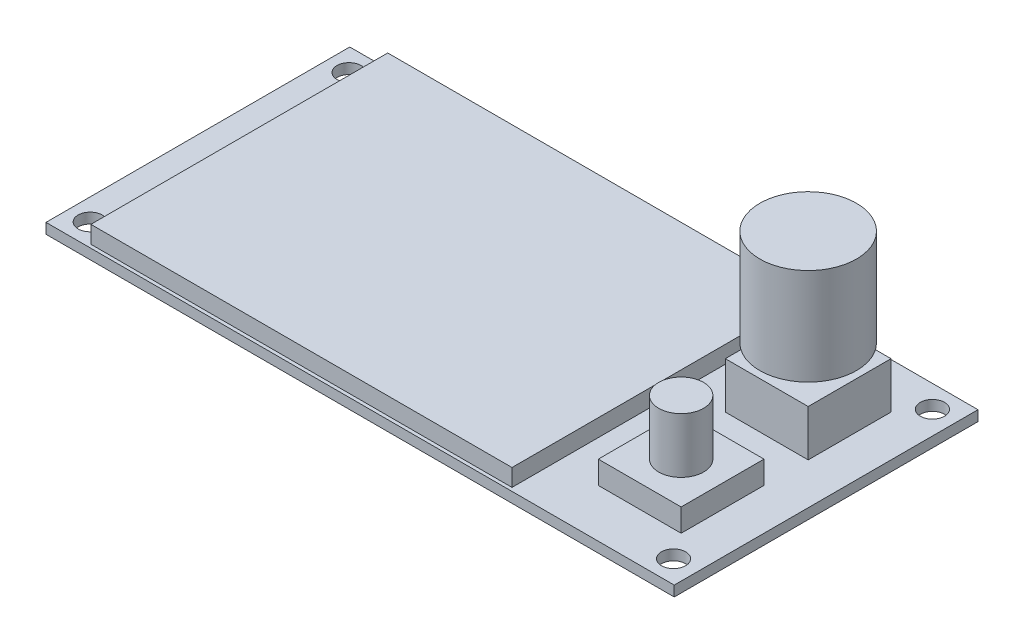
ISO-10303-21;
HEADER;
FILE_DESCRIPTION(('STEP AP214'),'2;1');
FILE_NAME('part.step','',(''),(''),'','','');
FILE_SCHEMA(('AUTOMOTIVE_DESIGN { 1 0 10303 214 1 1 1 1 }'));
ENDSEC;
DATA;
#1=APPLICATION_CONTEXT('core data for automotive mechanical design processes');
#2=APPLICATION_PROTOCOL_DEFINITION('international standard','automotive_design',2000,#1);
#3=PRODUCT_CONTEXT('',#1,'mechanical');
#4=PRODUCT('Part','Part','',(#3));
#5=PRODUCT_RELATED_PRODUCT_CATEGORY('part','',(#4));
#6=PRODUCT_DEFINITION_FORMATION('','',#4);
#7=PRODUCT_DEFINITION_CONTEXT('part definition',#1,'design');
#8=PRODUCT_DEFINITION('design','',#6,#7);
#9=PRODUCT_DEFINITION_SHAPE('','',#8);
#10=(LENGTH_UNIT() NAMED_UNIT(*) SI_UNIT(.MILLI.,.METRE.));
#11=(NAMED_UNIT(*) PLANE_ANGLE_UNIT() SI_UNIT($,.RADIAN.));
#12=(NAMED_UNIT(*) SI_UNIT($,.STERADIAN.) SOLID_ANGLE_UNIT());
#13=UNCERTAINTY_MEASURE_WITH_UNIT(LENGTH_MEASURE(1.E-05),#10,'distance_accuracy_value','');
#14=(GEOMETRIC_REPRESENTATION_CONTEXT(3) GLOBAL_UNCERTAINTY_ASSIGNED_CONTEXT((#13)) GLOBAL_UNIT_ASSIGNED_CONTEXT((#10,
#11,#12)) REPRESENTATION_CONTEXT('',''));
#15=CARTESIAN_POINT('',(0.,0.,0.));
#16=DIRECTION('',(0.,0.,1.));
#17=DIRECTION('',(1.,0.,0.));
#18=AXIS2_PLACEMENT_3D('',#15,#16,#17);
#19=CARTESIAN_POINT('',(73.,8.2,-19.));
#20=DIRECTION('',(1.,0.,0.));
#21=DIRECTION('',(0.,0.,-1.));
#22=AXIS2_PLACEMENT_3D('',#19,#20,#21);
#23=PLANE('',#22);
#24=DIRECTION('',(0.,0.,1.));
#25=VECTOR('',#24,1.);
#26=CARTESIAN_POINT('',(73.,4.8,-19.));
#27=LINE('',#26,#25);
#28=CARTESIAN_POINT('',(73.,4.8,-19.));
#29=VERTEX_POINT('',#28);
#30=CARTESIAN_POINT('',(73.,4.8,-7.));
#31=VERTEX_POINT('',#30);
#32=EDGE_CURVE('E161',#29,#31,#27,.T.);
#33=ORIENTED_EDGE('',*,*,#32,.F.);
#34=DIRECTION('',(0.,-1.,0.));
#35=VECTOR('',#34,1.);
#36=CARTESIAN_POINT('',(73.,8.2,-19.));
#37=LINE('',#36,#35);
#38=CARTESIAN_POINT('',(73.,1.5,-19.));
#39=VERTEX_POINT('',#38);
#40=EDGE_CURVE('E172',#29,#39,#37,.T.);
#41=ORIENTED_EDGE('',*,*,#40,.T.);
#42=DIRECTION('',(0.,0.,1.));
#43=VECTOR('',#42,1.);
#44=CARTESIAN_POINT('',(73.,1.5,-19.));
#45=LINE('',#44,#43);
#46=CARTESIAN_POINT('',(73.,1.5,-7.));
#47=VERTEX_POINT('',#46);
#48=EDGE_CURVE('E200',#39,#47,#45,.T.);
#49=ORIENTED_EDGE('',*,*,#48,.T.);
#50=DIRECTION('',(0.,-1.,0.));
#51=VECTOR('',#50,1.);
#52=CARTESIAN_POINT('',(73.,8.2,-7.));
#53=LINE('',#52,#51);
#54=EDGE_CURVE('E174',#31,#47,#53,.T.);
#55=ORIENTED_EDGE('',*,*,#54,.F.);
#56=EDGE_LOOP('',(#33,#41,#49,#55));
#57=FACE_BOUND('',#56,.T.);
#58=ADVANCED_FACE('F45',(#57),#23,.F.);
#59=CARTESIAN_POINT('',(73.,8.2,-7.));
#60=DIRECTION('',(0.,0.,-1.));
#61=DIRECTION('',(-1.,0.,0.));
#62=AXIS2_PLACEMENT_3D('',#59,#60,#61);
#63=PLANE('',#62);
#64=DIRECTION('',(1.,0.,0.));
#65=VECTOR('',#64,1.);
#66=CARTESIAN_POINT('',(73.,4.8,-7.));
#67=LINE('',#66,#65);
#68=CARTESIAN_POINT('',(85.,4.8,-7.));
#69=VERTEX_POINT('',#68);
#70=EDGE_CURVE('E176',#31,#69,#67,.T.);
#71=ORIENTED_EDGE('',*,*,#70,.F.);
#72=ORIENTED_EDGE('',*,*,#54,.T.);
#73=DIRECTION('',(1.,0.,0.));
#74=VECTOR('',#73,1.);
#75=CARTESIAN_POINT('',(73.,1.5,-7.));
#76=LINE('',#75,#74);
#77=CARTESIAN_POINT('',(85.,1.5,-7.));
#78=VERTEX_POINT('',#77);
#79=EDGE_CURVE('E196',#47,#78,#76,.T.);
#80=ORIENTED_EDGE('',*,*,#79,.T.);
#81=DIRECTION('',(0.,-1.,0.));
#82=VECTOR('',#81,1.);
#83=CARTESIAN_POINT('',(85.,8.2,-7.));
#84=LINE('',#83,#82);
#85=EDGE_CURVE('E189',#69,#78,#84,.T.);
#86=ORIENTED_EDGE('',*,*,#85,.F.);
#87=EDGE_LOOP('',(#71,#72,#80,#86));
#88=FACE_BOUND('',#87,.T.);
#89=ADVANCED_FACE('F408',(#88),#63,.F.);
#90=CARTESIAN_POINT('',(85.,8.2,-19.));
#91=DIRECTION('',(-1.,0.,0.));
#92=DIRECTION('',(0.,0.,1.));
#93=AXIS2_PLACEMENT_3D('',#90,#91,#92);
#94=PLANE('',#93);
#95=DIRECTION('',(0.,0.,-1.));
#96=VECTOR('',#95,1.);
#97=CARTESIAN_POINT('',(85.,4.8,-7.));
#98=LINE('',#97,#96);
#99=CARTESIAN_POINT('',(85.,4.8,-19.));
#100=VERTEX_POINT('',#99);
#101=EDGE_CURVE('E63',#69,#100,#98,.T.);
#102=ORIENTED_EDGE('',*,*,#101,.F.);
#103=ORIENTED_EDGE('',*,*,#85,.T.);
#104=DIRECTION('',(0.,0.,-1.));
#105=VECTOR('',#104,1.);
#106=CARTESIAN_POINT('',(85.,1.5,-19.));
#107=LINE('',#106,#105);
#108=CARTESIAN_POINT('',(85.,1.5,-19.));
#109=VERTEX_POINT('',#108);
#110=EDGE_CURVE('E187',#78,#109,#107,.T.);
#111=ORIENTED_EDGE('',*,*,#110,.T.);
#112=DIRECTION('',(0.,-1.,0.));
#113=VECTOR('',#112,1.);
#114=CARTESIAN_POINT('',(85.,8.2,-19.));
#115=LINE('',#114,#113);
#116=EDGE_CURVE('E183',#100,#109,#115,.T.);
#117=ORIENTED_EDGE('',*,*,#116,.F.);
#118=EDGE_LOOP('',(#102,#103,#111,#117));
#119=FACE_BOUND('',#118,.T.);
#120=ADVANCED_FACE('F404',(#119),#94,.F.);
#121=CARTESIAN_POINT('',(73.,8.2,-19.));
#122=DIRECTION('',(0.,0.,1.));
#123=DIRECTION('',(1.,0.,0.));
#124=AXIS2_PLACEMENT_3D('',#121,#122,#123);
#125=PLANE('',#124);
#126=DIRECTION('',(-1.,0.,0.));
#127=VECTOR('',#126,1.);
#128=CARTESIAN_POINT('',(85.,4.8,-19.));
#129=LINE('',#128,#127);
#130=EDGE_CURVE('E158',#100,#29,#129,.T.);
#131=ORIENTED_EDGE('',*,*,#130,.F.);
#132=ORIENTED_EDGE('',*,*,#116,.T.);
#133=DIRECTION('',(-1.,0.,0.));
#134=VECTOR('',#133,1.);
#135=CARTESIAN_POINT('',(73.,1.5,-19.));
#136=LINE('',#135,#134);
#137=EDGE_CURVE('E181',#109,#39,#136,.T.);
#138=ORIENTED_EDGE('',*,*,#137,.T.);
#139=ORIENTED_EDGE('',*,*,#40,.F.);
#140=EDGE_LOOP('',(#131,#132,#138,#139));
#141=FACE_BOUND('',#140,.T.);
#142=ADVANCED_FACE('F179',(#141),#125,.F.);
#143=CARTESIAN_POINT('',(0.,1.5,0.));
#144=DIRECTION('',(0.,-1.,0.));
#145=DIRECTION('',(0.,0.,-1.));
#146=AXIS2_PLACEMENT_3D('',#143,#144,#145);
#147=PLANE('',#146);
#148=ORIENTED_EDGE('',*,*,#48,.F.);
#149=ORIENTED_EDGE('',*,*,#137,.F.);
#150=ORIENTED_EDGE('',*,*,#110,.F.);
#151=ORIENTED_EDGE('',*,*,#79,.F.);
#152=EDGE_LOOP('',(#148,#149,#150,#151));
#153=FACE_BOUND('',#152,.T.);
#154=CARTESIAN_POINT('',(3.15000000000001,1.5,-40.75));
#155=DIRECTION('',(0.,1.,0.));
#156=DIRECTION('',(0.,0.,1.));
#157=AXIS2_PLACEMENT_3D('',#154,#155,#156);
#158=CIRCLE('',#157,1.75);
#159=CARTESIAN_POINT('',(3.15000000000001,1.5,-39.));
#160=VERTEX_POINT('',#159);
#161=EDGE_CURVE('E213',#160,#160,#158,.T.);
#162=ORIENTED_EDGE('',*,*,#161,.F.);
#163=EDGE_LOOP('',(#162));
#164=FACE_BOUND('',#163,.T.);
#165=CARTESIAN_POINT('',(3.15000000000002,1.5,-3.25));
#166=DIRECTION('',(0.,1.,0.));
#167=DIRECTION('',(0.,0.,1.));
#168=AXIS2_PLACEMENT_3D('',#165,#166,#167);
#169=CIRCLE('',#168,1.75);
#170=CARTESIAN_POINT('',(3.15000000000002,1.5,-1.5));
#171=VERTEX_POINT('',#170);
#172=EDGE_CURVE('E209',#171,#171,#169,.T.);
#173=ORIENTED_EDGE('',*,*,#172,.F.);
#174=EDGE_LOOP('',(#173));
#175=FACE_BOUND('',#174,.T.);
#176=CARTESIAN_POINT('',(87.65,1.5,-3.25));
#177=DIRECTION('',(0.,1.,0.));
#178=DIRECTION('',(0.,0.,1.));
#179=AXIS2_PLACEMENT_3D('',#176,#177,#178);
#180=CIRCLE('',#179,1.75);
#181=CARTESIAN_POINT('',(87.65,1.5,-1.5));
#182=VERTEX_POINT('',#181);
#183=EDGE_CURVE('E204',#182,#182,#180,.T.);
#184=ORIENTED_EDGE('',*,*,#183,.F.);
#185=EDGE_LOOP('',(#184));
#186=FACE_BOUND('',#185,.T.);
#187=CARTESIAN_POINT('',(87.65,1.5,-40.75));
#188=DIRECTION('',(0.,1.,0.));
#189=DIRECTION('',(0.,0.,1.));
#190=AXIS2_PLACEMENT_3D('',#187,#188,#189);
#191=CIRCLE('',#190,1.75);
#192=CARTESIAN_POINT('',(87.65,1.5,-39.));
#193=VERTEX_POINT('',#192);
#194=EDGE_CURVE('E208',#193,#193,#191,.T.);
#195=ORIENTED_EDGE('',*,*,#194,.F.);
#196=EDGE_LOOP('',(#195));
#197=FACE_BOUND('',#196,.T.);
#198=DIRECTION('',(0.,0.,1.));
#199=VECTOR('',#198,1.);
#200=CARTESIAN_POINT('',(0.,1.5,0.));
#201=LINE('',#200,#199);
#202=CARTESIAN_POINT('',(0.,1.5,-44.));
#203=VERTEX_POINT('',#202);
#204=CARTESIAN_POINT('',(0.,1.5,0.));
#205=VERTEX_POINT('',#204);
#206=EDGE_CURVE('E268',#203,#205,#201,.T.);
#207=ORIENTED_EDGE('',*,*,#206,.T.);
#208=DIRECTION('',(1.,0.,0.));
#209=VECTOR('',#208,1.);
#210=CARTESIAN_POINT('',(0.,1.5,0.));
#211=LINE('',#210,#209);
#212=CARTESIAN_POINT('',(91.,1.5,0.));
#213=VERTEX_POINT('',#212);
#214=EDGE_CURVE('E272',#205,#213,#211,.T.);
#215=ORIENTED_EDGE('',*,*,#214,.T.);
#216=DIRECTION('',(0.,0.,-1.));
#217=VECTOR('',#216,1.);
#218=CARTESIAN_POINT('',(91.,1.5,0.));
#219=LINE('',#218,#217);
#220=CARTESIAN_POINT('',(91.,1.5,-44.));
#221=VERTEX_POINT('',#220);
#222=EDGE_CURVE('E276',#213,#221,#219,.T.);
#223=ORIENTED_EDGE('',*,*,#222,.T.);
#224=DIRECTION('',(-1.,0.,0.));
#225=VECTOR('',#224,1.);
#226=CARTESIAN_POINT('',(0.,1.5,-44.));
#227=LINE('',#226,#225);
#228=EDGE_CURVE('E279',#221,#203,#227,.T.);
#229=ORIENTED_EDGE('',*,*,#228,.T.);
#230=EDGE_LOOP('',(#207,#215,#223,#229));
#231=FACE_BOUND('',#230,.T.);
#232=DIRECTION('',(0.,0.,1.));
#233=VECTOR('',#232,1.);
#234=CARTESIAN_POINT('',(5.99999999999999,1.5,-43.5));
#235=LINE('',#234,#233);
#236=CARTESIAN_POINT('',(5.99999999999999,1.5,-43.5));
#237=VERTEX_POINT('',#236);
#238=CARTESIAN_POINT('',(6.,1.5,-0.500000000000001));
#239=VERTEX_POINT('',#238);
#240=EDGE_CURVE('E237',#237,#239,#235,.T.);
#241=ORIENTED_EDGE('',*,*,#240,.F.);
#242=DIRECTION('',(-1.,0.,0.));
#243=VECTOR('',#242,1.);
#244=CARTESIAN_POINT('',(5.99999999999999,1.5,-43.5));
#245=LINE('',#244,#243);
#246=CARTESIAN_POINT('',(67.,1.5,-43.5));
#247=VERTEX_POINT('',#246);
#248=EDGE_CURVE('E227',#247,#237,#245,.T.);
#249=ORIENTED_EDGE('',*,*,#248,.F.);
#250=DIRECTION('',(0.,0.,-1.));
#251=VECTOR('',#250,1.);
#252=CARTESIAN_POINT('',(67.,1.5,-43.5));
#253=LINE('',#252,#251);
#254=CARTESIAN_POINT('',(67.,1.5,-0.500000000000001));
#255=VERTEX_POINT('',#254);
#256=EDGE_CURVE('E245',#255,#247,#253,.T.);
#257=ORIENTED_EDGE('',*,*,#256,.F.);
#258=DIRECTION('',(1.,0.,0.));
#259=VECTOR('',#258,1.);
#260=CARTESIAN_POINT('',(6.,1.5,-0.500000000000001));
#261=LINE('',#260,#259);
#262=EDGE_CURVE('E241',#239,#255,#261,.T.);
#263=ORIENTED_EDGE('',*,*,#262,.F.);
#264=EDGE_LOOP('',(#241,#249,#257,#263));
#265=FACE_BOUND('',#264,.T.);
#266=DIRECTION('',(0.,0.,1.));
#267=VECTOR('',#266,1.);
#268=CARTESIAN_POINT('',(73.,1.5,-37.4));
#269=LINE('',#268,#267);
#270=CARTESIAN_POINT('',(73.,1.5,-37.4));
#271=VERTEX_POINT('',#270);
#272=CARTESIAN_POINT('',(73.,1.5,-25.4));
#273=VERTEX_POINT('',#272);
#274=EDGE_CURVE('E203',#271,#273,#269,.T.);
#275=ORIENTED_EDGE('',*,*,#274,.F.);
#276=DIRECTION('',(-1.,0.,0.));
#277=VECTOR('',#276,1.);
#278=CARTESIAN_POINT('',(73.,1.5,-37.4));
#279=LINE('',#278,#277);
#280=CARTESIAN_POINT('',(85.,1.5,-37.4));
#281=VERTEX_POINT('',#280);
#282=EDGE_CURVE('E361',#281,#271,#279,.T.);
#283=ORIENTED_EDGE('',*,*,#282,.F.);
#284=DIRECTION('',(0.,0.,-1.));
#285=VECTOR('',#284,1.);
#286=CARTESIAN_POINT('',(85.,1.5,-37.4));
#287=LINE('',#286,#285);
#288=CARTESIAN_POINT('',(85.,1.5,-25.4));
#289=VERTEX_POINT('',#288);
#290=EDGE_CURVE('E379',#289,#281,#287,.T.);
#291=ORIENTED_EDGE('',*,*,#290,.F.);
#292=DIRECTION('',(1.,0.,0.));
#293=VECTOR('',#292,1.);
#294=CARTESIAN_POINT('',(73.,1.5,-25.4));
#295=LINE('',#294,#293);
#296=EDGE_CURVE('E71',#273,#289,#295,.T.);
#297=ORIENTED_EDGE('',*,*,#296,.F.);
#298=EDGE_LOOP('',(#275,#283,#291,#297));
#299=FACE_BOUND('',#298,.T.);
#300=ADVANCED_FACE('F354',(#153,#164,#175,#186,#197,#231,#265,#299),#147,.F.);
#301=CARTESIAN_POINT('',(0.,1.5,0.));
#302=DIRECTION('',(1.,0.,0.));
#303=DIRECTION('',(0.,0.,-1.));
#304=AXIS2_PLACEMENT_3D('',#301,#302,#303);
#305=PLANE('',#304);
#306=DIRECTION('',(0.,0.,1.));
#307=VECTOR('',#306,1.);
#308=CARTESIAN_POINT('',(0.,0.,0.));
#309=LINE('',#308,#307);
#310=CARTESIAN_POINT('',(0.,0.,-44.));
#311=VERTEX_POINT('',#310);
#312=CARTESIAN_POINT('',(0.,0.,0.));
#313=VERTEX_POINT('',#312);
#314=EDGE_CURVE('E267',#311,#313,#309,.T.);
#315=ORIENTED_EDGE('',*,*,#314,.T.);
#316=DIRECTION('',(0.,-1.,0.));
#317=VECTOR('',#316,1.);
#318=CARTESIAN_POINT('',(0.,1.5,0.));
#319=LINE('',#318,#317);
#320=EDGE_CURVE('E55',#205,#313,#319,.T.);
#321=ORIENTED_EDGE('',*,*,#320,.F.);
#322=ORIENTED_EDGE('',*,*,#206,.F.);
#323=DIRECTION('',(0.,-1.,0.));
#324=VECTOR('',#323,1.);
#325=CARTESIAN_POINT('',(0.,1.5,-44.));
#326=LINE('',#325,#324);
#327=EDGE_CURVE('E282',#203,#311,#326,.T.);
#328=ORIENTED_EDGE('',*,*,#327,.T.);
#329=EDGE_LOOP('',(#315,#321,#322,#328));
#330=FACE_BOUND('',#329,.T.);
#331=ADVANCED_FACE('F47',(#330),#305,.F.);
#332=CARTESIAN_POINT('',(0.,1.5,0.));
#333=DIRECTION('',(0.,0.,-1.));
#334=DIRECTION('',(-1.,0.,0.));
#335=AXIS2_PLACEMENT_3D('',#332,#333,#334);
#336=PLANE('',#335);
#337=DIRECTION('',(1.,0.,0.));
#338=VECTOR('',#337,1.);
#339=CARTESIAN_POINT('',(0.,0.,0.));
#340=LINE('',#339,#338);
#341=CARTESIAN_POINT('',(91.,0.,0.));
#342=VERTEX_POINT('',#341);
#343=EDGE_CURVE('E286',#313,#342,#340,.T.);
#344=ORIENTED_EDGE('',*,*,#343,.T.);
#345=DIRECTION('',(0.,-1.,0.));
#346=VECTOR('',#345,1.);
#347=CARTESIAN_POINT('',(91.,1.5,0.));
#348=LINE('',#347,#346);
#349=EDGE_CURVE('E301',#213,#342,#348,.T.);
#350=ORIENTED_EDGE('',*,*,#349,.F.);
#351=ORIENTED_EDGE('',*,*,#214,.F.);
#352=ORIENTED_EDGE('',*,*,#320,.T.);
#353=EDGE_LOOP('',(#344,#350,#351,#352));
#354=FACE_BOUND('',#353,.T.);
#355=ADVANCED_FACE('F352',(#354),#336,.F.);
#356=CARTESIAN_POINT('',(91.,1.5,0.));
#357=DIRECTION('',(-1.,0.,0.));
#358=DIRECTION('',(0.,0.,1.));
#359=AXIS2_PLACEMENT_3D('',#356,#357,#358);
#360=PLANE('',#359);
#361=DIRECTION('',(0.,0.,-1.));
#362=VECTOR('',#361,1.);
#363=CARTESIAN_POINT('',(91.,0.,0.));
#364=LINE('',#363,#362);
#365=CARTESIAN_POINT('',(91.,0.,-44.));
#366=VERTEX_POINT('',#365);
#367=EDGE_CURVE('E289',#342,#366,#364,.T.);
#368=ORIENTED_EDGE('',*,*,#367,.T.);
#369=DIRECTION('',(0.,-1.,0.));
#370=VECTOR('',#369,1.);
#371=CARTESIAN_POINT('',(91.,1.5,-44.));
#372=LINE('',#371,#370);
#373=EDGE_CURVE('E297',#221,#366,#372,.T.);
#374=ORIENTED_EDGE('',*,*,#373,.F.);
#375=ORIENTED_EDGE('',*,*,#222,.F.);
#376=ORIENTED_EDGE('',*,*,#349,.T.);
#377=EDGE_LOOP('',(#368,#374,#375,#376));
#378=FACE_BOUND('',#377,.T.);
#379=ADVANCED_FACE('F349',(#378),#360,.F.);
#380=CARTESIAN_POINT('',(0.,1.5,-44.));
#381=DIRECTION('',(0.,0.,1.));
#382=DIRECTION('',(1.,0.,0.));
#383=AXIS2_PLACEMENT_3D('',#380,#381,#382);
#384=PLANE('',#383);
#385=DIRECTION('',(-1.,0.,0.));
#386=VECTOR('',#385,1.);
#387=CARTESIAN_POINT('',(0.,0.,-44.));
#388=LINE('',#387,#386);
#389=EDGE_CURVE('E273',#366,#311,#388,.T.);
#390=ORIENTED_EDGE('',*,*,#389,.T.);
#391=ORIENTED_EDGE('',*,*,#327,.F.);
#392=ORIENTED_EDGE('',*,*,#228,.F.);
#393=ORIENTED_EDGE('',*,*,#373,.T.);
#394=EDGE_LOOP('',(#390,#391,#392,#393));
#395=FACE_BOUND('',#394,.T.);
#396=ADVANCED_FACE('F330',(#395),#384,.F.);
#397=CARTESIAN_POINT('',(0.,0.,0.));
#398=DIRECTION('',(0.,-1.,0.));
#399=DIRECTION('',(0.,0.,-1.));
#400=AXIS2_PLACEMENT_3D('',#397,#398,#399);
#401=PLANE('',#400);
#402=CARTESIAN_POINT('',(3.15000000000001,0.,-40.75));
#403=DIRECTION('',(0.,-1.,0.));
#404=DIRECTION('',(0.,0.,-1.));
#405=AXIS2_PLACEMENT_3D('',#402,#403,#404);
#406=CIRCLE('',#405,1.75);
#407=CARTESIAN_POINT('',(3.15000000000001,0.,-42.5));
#408=VERTEX_POINT('',#407);
#409=EDGE_CURVE('E49',#408,#408,#406,.T.);
#410=ORIENTED_EDGE('',*,*,#409,.F.);
#411=EDGE_LOOP('',(#410));
#412=FACE_BOUND('',#411,.T.);
#413=CARTESIAN_POINT('',(3.15000000000002,0.,-3.25));
#414=DIRECTION('',(0.,-1.,0.));
#415=DIRECTION('',(0.,0.,-1.));
#416=AXIS2_PLACEMENT_3D('',#413,#414,#415);
#417=CIRCLE('',#416,1.75);
#418=CARTESIAN_POINT('',(3.15000000000002,0.,-5.));
#419=VERTEX_POINT('',#418);
#420=EDGE_CURVE('E314',#419,#419,#417,.T.);
#421=ORIENTED_EDGE('',*,*,#420,.F.);
#422=EDGE_LOOP('',(#421));
#423=FACE_BOUND('',#422,.T.);
#424=CARTESIAN_POINT('',(87.65,0.,-3.25));
#425=DIRECTION('',(0.,-1.,0.));
#426=DIRECTION('',(0.,0.,-1.));
#427=AXIS2_PLACEMENT_3D('',#424,#425,#426);
#428=CIRCLE('',#427,1.75);
#429=CARTESIAN_POINT('',(87.65,0.,-5.));
#430=VERTEX_POINT('',#429);
#431=EDGE_CURVE('E311',#430,#430,#428,.T.);
#432=ORIENTED_EDGE('',*,*,#431,.F.);
#433=EDGE_LOOP('',(#432));
#434=FACE_BOUND('',#433,.T.);
#435=CARTESIAN_POINT('',(87.65,0.,-40.75));
#436=DIRECTION('',(0.,-1.,0.));
#437=DIRECTION('',(0.,0.,-1.));
#438=AXIS2_PLACEMENT_3D('',#435,#436,#437);
#439=CIRCLE('',#438,1.75);
#440=CARTESIAN_POINT('',(87.65,0.,-42.5));
#441=VERTEX_POINT('',#440);
#442=EDGE_CURVE('E221',#441,#441,#439,.T.);
#443=ORIENTED_EDGE('',*,*,#442,.F.);
#444=EDGE_LOOP('',(#443));
#445=FACE_BOUND('',#444,.T.);
#446=ORIENTED_EDGE('',*,*,#314,.F.);
#447=ORIENTED_EDGE('',*,*,#389,.F.);
#448=ORIENTED_EDGE('',*,*,#367,.F.);
#449=ORIENTED_EDGE('',*,*,#343,.F.);
#450=EDGE_LOOP('',(#446,#447,#448,#449));
#451=FACE_BOUND('',#450,.T.);
#452=ADVANCED_FACE('F326',(#412,#423,#434,#445,#451),#401,.T.);
#453=CARTESIAN_POINT('',(5.99999999999999,4.,-43.5));
#454=DIRECTION('',(1.,0.,0.));
#455=DIRECTION('',(0.,0.,-1.));
#456=AXIS2_PLACEMENT_3D('',#453,#454,#455);
#457=PLANE('',#456);
#458=ORIENTED_EDGE('',*,*,#240,.T.);
#459=DIRECTION('',(0.,-1.,0.));
#460=VECTOR('',#459,1.);
#461=CARTESIAN_POINT('',(6.,4.,-0.500000000000001));
#462=LINE('',#461,#460);
#463=CARTESIAN_POINT('',(6.,4.,-0.500000000000001));
#464=VERTEX_POINT('',#463);
#465=EDGE_CURVE('E263',#464,#239,#462,.T.);
#466=ORIENTED_EDGE('',*,*,#465,.F.);
#467=DIRECTION('',(0.,0.,1.));
#468=VECTOR('',#467,1.);
#469=CARTESIAN_POINT('',(5.99999999999999,4.,-43.5));
#470=LINE('',#469,#468);
#471=CARTESIAN_POINT('',(5.99999999999999,4.,-43.5));
#472=VERTEX_POINT('',#471);
#473=EDGE_CURVE('E222',#472,#464,#470,.T.);
#474=ORIENTED_EDGE('',*,*,#473,.F.);
#475=DIRECTION('',(0.,-1.,0.));
#476=VECTOR('',#475,1.);
#477=CARTESIAN_POINT('',(5.99999999999999,4.,-43.5));
#478=LINE('',#477,#476);
#479=EDGE_CURVE('E236',#472,#237,#478,.T.);
#480=ORIENTED_EDGE('',*,*,#479,.T.);
#481=EDGE_LOOP('',(#458,#466,#474,#480));
#482=FACE_BOUND('',#481,.T.);
#483=ADVANCED_FACE('F329',(#482),#457,.F.);
#484=CARTESIAN_POINT('',(6.,4.,-0.500000000000001));
#485=DIRECTION('',(0.,0.,-1.));
#486=DIRECTION('',(-1.,0.,0.));
#487=AXIS2_PLACEMENT_3D('',#484,#485,#486);
#488=PLANE('',#487);
#489=ORIENTED_EDGE('',*,*,#262,.T.);
#490=DIRECTION('',(0.,-1.,0.));
#491=VECTOR('',#490,1.);
#492=CARTESIAN_POINT('',(67.,4.,-0.500000000000001));
#493=LINE('',#492,#491);
#494=CARTESIAN_POINT('',(67.,4.,-0.500000000000001));
#495=VERTEX_POINT('',#494);
#496=EDGE_CURVE('E259',#495,#255,#493,.T.);
#497=ORIENTED_EDGE('',*,*,#496,.F.);
#498=DIRECTION('',(1.,0.,0.));
#499=VECTOR('',#498,1.);
#500=CARTESIAN_POINT('',(6.,4.,-0.500000000000001));
#501=LINE('',#500,#499);
#502=EDGE_CURVE('E226',#464,#495,#501,.T.);
#503=ORIENTED_EDGE('',*,*,#502,.F.);
#504=ORIENTED_EDGE('',*,*,#465,.T.);
#505=EDGE_LOOP('',(#489,#497,#503,#504));
#506=FACE_BOUND('',#505,.T.);
#507=ADVANCED_FACE('F481',(#506),#488,.F.);
#508=CARTESIAN_POINT('',(67.,4.,-43.5));
#509=DIRECTION('',(-1.,0.,0.));
#510=DIRECTION('',(0.,0.,1.));
#511=AXIS2_PLACEMENT_3D('',#508,#509,#510);
#512=PLANE('',#511);
#513=ORIENTED_EDGE('',*,*,#256,.T.);
#514=DIRECTION('',(0.,-1.,0.));
#515=VECTOR('',#514,1.);
#516=CARTESIAN_POINT('',(67.,4.,-43.5));
#517=LINE('',#516,#515);
#518=CARTESIAN_POINT('',(67.,4.,-43.5));
#519=VERTEX_POINT('',#518);
#520=EDGE_CURVE('E255',#519,#247,#517,.T.);
#521=ORIENTED_EDGE('',*,*,#520,.F.);
#522=DIRECTION('',(0.,0.,-1.));
#523=VECTOR('',#522,1.);
#524=CARTESIAN_POINT('',(67.,4.,-43.5));
#525=LINE('',#524,#523);
#526=EDGE_CURVE('E230',#495,#519,#525,.T.);
#527=ORIENTED_EDGE('',*,*,#526,.F.);
#528=ORIENTED_EDGE('',*,*,#496,.T.);
#529=EDGE_LOOP('',(#513,#521,#527,#528));
#530=FACE_BOUND('',#529,.T.);
#531=ADVANCED_FACE('F477',(#530),#512,.F.);
#532=CARTESIAN_POINT('',(5.99999999999999,4.,-43.5));
#533=DIRECTION('',(0.,0.,1.));
#534=DIRECTION('',(1.,0.,0.));
#535=AXIS2_PLACEMENT_3D('',#532,#533,#534);
#536=PLANE('',#535);
#537=ORIENTED_EDGE('',*,*,#248,.T.);
#538=ORIENTED_EDGE('',*,*,#479,.F.);
#539=DIRECTION('',(-1.,0.,0.));
#540=VECTOR('',#539,1.);
#541=CARTESIAN_POINT('',(5.99999999999999,4.,-43.5));
#542=LINE('',#541,#540);
#543=EDGE_CURVE('E233',#519,#472,#542,.T.);
#544=ORIENTED_EDGE('',*,*,#543,.F.);
#545=ORIENTED_EDGE('',*,*,#520,.T.);
#546=EDGE_LOOP('',(#537,#538,#544,#545));
#547=FACE_BOUND('',#546,.T.);
#548=ADVANCED_FACE('F473',(#547),#536,.F.);
#549=CARTESIAN_POINT('',(0.,4.,0.));
#550=DIRECTION('',(0.,1.,0.));
#551=DIRECTION('',(0.,0.,1.));
#552=AXIS2_PLACEMENT_3D('',#549,#550,#551);
#553=PLANE('',#552);
#554=ORIENTED_EDGE('',*,*,#473,.T.);
#555=ORIENTED_EDGE('',*,*,#502,.T.);
#556=ORIENTED_EDGE('',*,*,#526,.T.);
#557=ORIENTED_EDGE('',*,*,#543,.T.);
#558=EDGE_LOOP('',(#554,#555,#556,#557));
#559=FACE_BOUND('',#558,.T.);
#560=ADVANCED_FACE('F469',(#559),#553,.T.);
#561=CARTESIAN_POINT('',(87.65,-1.,-40.75));
#562=DIRECTION('',(0.,1.,0.));
#563=DIRECTION('',(0.,0.,1.));
#564=AXIS2_PLACEMENT_3D('',#561,#562,#563);
#565=CYLINDRICAL_SURFACE('',#564,1.75);
#566=ORIENTED_EDGE('',*,*,#442,.T.);
#567=EDGE_LOOP('',(#566));
#568=FACE_BOUND('',#567,.T.);
#569=ORIENTED_EDGE('',*,*,#194,.T.);
#570=EDGE_LOOP('',(#569));
#571=FACE_BOUND('',#570,.T.);
#572=ADVANCED_FACE('F461',(#568,#571),#565,.F.);
#573=CARTESIAN_POINT('',(87.65,-1.,-3.25));
#574=DIRECTION('',(0.,1.,0.));
#575=DIRECTION('',(0.,0.,1.));
#576=AXIS2_PLACEMENT_3D('',#573,#574,#575);
#577=CYLINDRICAL_SURFACE('',#576,1.75);
#578=ORIENTED_EDGE('',*,*,#431,.T.);
#579=EDGE_LOOP('',(#578));
#580=FACE_BOUND('',#579,.T.);
#581=ORIENTED_EDGE('',*,*,#183,.T.);
#582=EDGE_LOOP('',(#581));
#583=FACE_BOUND('',#582,.T.);
#584=ADVANCED_FACE('F457',(#580,#583),#577,.F.);
#585=CARTESIAN_POINT('',(3.15000000000002,-1.,-3.25));
#586=DIRECTION('',(0.,1.,0.));
#587=DIRECTION('',(0.,0.,1.));
#588=AXIS2_PLACEMENT_3D('',#585,#586,#587);
#589=CYLINDRICAL_SURFACE('',#588,1.75);
#590=ORIENTED_EDGE('',*,*,#420,.T.);
#591=EDGE_LOOP('',(#590));
#592=FACE_BOUND('',#591,.T.);
#593=ORIENTED_EDGE('',*,*,#172,.T.);
#594=EDGE_LOOP('',(#593));
#595=FACE_BOUND('',#594,.T.);
#596=ADVANCED_FACE('F460',(#592,#595),#589,.F.);
#597=CARTESIAN_POINT('',(3.15000000000001,-1.,-40.75));
#598=DIRECTION('',(0.,1.,0.));
#599=DIRECTION('',(0.,0.,1.));
#600=AXIS2_PLACEMENT_3D('',#597,#598,#599);
#601=CYLINDRICAL_SURFACE('',#600,1.75);
#602=ORIENTED_EDGE('',*,*,#409,.T.);
#603=EDGE_LOOP('',(#602));
#604=FACE_BOUND('',#603,.T.);
#605=ORIENTED_EDGE('',*,*,#161,.T.);
#606=EDGE_LOOP('',(#605));
#607=FACE_BOUND('',#606,.T.);
#608=ADVANCED_FACE('F323',(#604,#607),#601,.F.);
#609=CARTESIAN_POINT('',(73.,8.2,-37.4));
#610=DIRECTION('',(1.,0.,0.));
#611=DIRECTION('',(0.,0.,-1.));
#612=AXIS2_PLACEMENT_3D('',#609,#610,#611);
#613=PLANE('',#612);
#614=ORIENTED_EDGE('',*,*,#274,.T.);
#615=DIRECTION('',(0.,-1.,0.));
#616=VECTOR('',#615,1.);
#617=CARTESIAN_POINT('',(73.,8.2,-25.4));
#618=LINE('',#617,#616);
#619=CARTESIAN_POINT('',(73.,8.2,-25.4));
#620=VERTEX_POINT('',#619);
#621=EDGE_CURVE('E217',#620,#273,#618,.T.);
#622=ORIENTED_EDGE('',*,*,#621,.F.);
#623=DIRECTION('',(0.,0.,1.));
#624=VECTOR('',#623,1.);
#625=CARTESIAN_POINT('',(73.,8.2,-37.4));
#626=LINE('',#625,#624);
#627=CARTESIAN_POINT('',(73.,8.2,-37.4));
#628=VERTEX_POINT('',#627);
#629=EDGE_CURVE('E378',#628,#620,#626,.T.);
#630=ORIENTED_EDGE('',*,*,#629,.F.);
#631=DIRECTION('',(0.,-1.,0.));
#632=VECTOR('',#631,1.);
#633=CARTESIAN_POINT('',(73.,8.2,-37.4));
#634=LINE('',#633,#632);
#635=EDGE_CURVE('E373',#628,#271,#634,.T.);
#636=ORIENTED_EDGE('',*,*,#635,.T.);
#637=EDGE_LOOP('',(#614,#622,#630,#636));
#638=FACE_BOUND('',#637,.T.);
#639=ADVANCED_FACE('F381',(#638),#613,.F.);
#640=CARTESIAN_POINT('',(73.,8.2,-25.4));
#641=DIRECTION('',(0.,0.,-1.));
#642=DIRECTION('',(-1.,0.,0.));
#643=AXIS2_PLACEMENT_3D('',#640,#641,#642);
#644=PLANE('',#643);
#645=ORIENTED_EDGE('',*,*,#296,.T.);
#646=DIRECTION('',(0.,-1.,0.));
#647=VECTOR('',#646,1.);
#648=CARTESIAN_POINT('',(85.,8.2,-25.4));
#649=LINE('',#648,#647);
#650=CARTESIAN_POINT('',(85.,8.2,-25.4));
#651=VERTEX_POINT('',#650);
#652=EDGE_CURVE('E388',#651,#289,#649,.T.);
#653=ORIENTED_EDGE('',*,*,#652,.F.);
#654=DIRECTION('',(1.,0.,0.));
#655=VECTOR('',#654,1.);
#656=CARTESIAN_POINT('',(73.,8.2,-25.4));
#657=LINE('',#656,#655);
#658=EDGE_CURVE('E416',#620,#651,#657,.T.);
#659=ORIENTED_EDGE('',*,*,#658,.F.);
#660=ORIENTED_EDGE('',*,*,#621,.T.);
#661=EDGE_LOOP('',(#645,#653,#659,#660));
#662=FACE_BOUND('',#661,.T.);
#663=ADVANCED_FACE('F428',(#662),#644,.F.);
#664=CARTESIAN_POINT('',(85.,8.2,-37.4));
#665=DIRECTION('',(-1.,0.,0.));
#666=DIRECTION('',(0.,0.,1.));
#667=AXIS2_PLACEMENT_3D('',#664,#665,#666);
#668=PLANE('',#667);
#669=ORIENTED_EDGE('',*,*,#290,.T.);
#670=DIRECTION('',(0.,-1.,0.));
#671=VECTOR('',#670,1.);
#672=CARTESIAN_POINT('',(85.,8.2,-37.4));
#673=LINE('',#672,#671);
#674=CARTESIAN_POINT('',(85.,8.2,-37.4));
#675=VERTEX_POINT('',#674);
#676=EDGE_CURVE('E376',#675,#281,#673,.T.);
#677=ORIENTED_EDGE('',*,*,#676,.F.);
#678=DIRECTION('',(0.,0.,-1.));
#679=VECTOR('',#678,1.);
#680=CARTESIAN_POINT('',(85.,8.2,-37.4));
#681=LINE('',#680,#679);
#682=EDGE_CURVE('E390',#651,#675,#681,.T.);
#683=ORIENTED_EDGE('',*,*,#682,.F.);
#684=ORIENTED_EDGE('',*,*,#652,.T.);
#685=EDGE_LOOP('',(#669,#677,#683,#684));
#686=FACE_BOUND('',#685,.T.);
#687=ADVANCED_FACE('F424',(#686),#668,.F.);
#688=CARTESIAN_POINT('',(73.,8.2,-37.4));
#689=DIRECTION('',(0.,0.,1.));
#690=DIRECTION('',(1.,0.,0.));
#691=AXIS2_PLACEMENT_3D('',#688,#689,#690);
#692=PLANE('',#691);
#693=ORIENTED_EDGE('',*,*,#282,.T.);
#694=ORIENTED_EDGE('',*,*,#635,.F.);
#695=DIRECTION('',(-1.,0.,0.));
#696=VECTOR('',#695,1.);
#697=CARTESIAN_POINT('',(73.,8.2,-37.4));
#698=LINE('',#697,#696);
#699=EDGE_CURVE('E384',#675,#628,#698,.T.);
#700=ORIENTED_EDGE('',*,*,#699,.F.);
#701=ORIENTED_EDGE('',*,*,#676,.T.);
#702=EDGE_LOOP('',(#693,#694,#700,#701));
#703=FACE_BOUND('',#702,.T.);
#704=ADVANCED_FACE('F371',(#703),#692,.F.);
#705=CARTESIAN_POINT('',(0.,8.2,0.));
#706=DIRECTION('',(0.,1.,0.));
#707=DIRECTION('',(0.,0.,1.));
#708=AXIS2_PLACEMENT_3D('',#705,#706,#707);
#709=PLANE('',#708);
#710=CARTESIAN_POINT('',(79.,8.2,-31.4));
#711=DIRECTION('',(0.,1.,0.));
#712=DIRECTION('',(0.,0.,1.));
#713=AXIS2_PLACEMENT_3D('',#710,#711,#712);
#714=CIRCLE('',#713,0.999999999999998);
#715=CARTESIAN_POINT('',(79.,8.2,-30.4));
#716=VERTEX_POINT('',#715);
#717=EDGE_CURVE('E711',#716,#716,#714,.T.);
#718=ORIENTED_EDGE('',*,*,#717,.F.);
#719=EDGE_LOOP('',(#718));
#720=FACE_BOUND('',#719,.T.);
#721=ORIENTED_EDGE('',*,*,#629,.T.);
#722=ORIENTED_EDGE('',*,*,#658,.T.);
#723=ORIENTED_EDGE('',*,*,#682,.T.);
#724=ORIENTED_EDGE('',*,*,#699,.T.);
#725=EDGE_LOOP('',(#721,#722,#723,#724));
#726=FACE_BOUND('',#725,.T.);
#727=ADVANCED_FACE('F430',(#720,#726),#709,.T.);
#728=CARTESIAN_POINT('',(0.,4.8,0.));
#729=DIRECTION('',(0.,1.,0.));
#730=DIRECTION('',(0.,0.,1.));
#731=AXIS2_PLACEMENT_3D('',#728,#729,#730);
#732=PLANE('',#731);
#733=CARTESIAN_POINT('',(79.,4.8,-13.));
#734=DIRECTION('',(0.,1.,0.));
#735=DIRECTION('',(0.,0.,1.));
#736=AXIS2_PLACEMENT_3D('',#733,#734,#735);
#737=CIRCLE('',#736,3.25000000000001);
#738=CARTESIAN_POINT('',(79.,4.8,-9.74999999999999));
#739=VERTEX_POINT('',#738);
#740=EDGE_CURVE('E11',#739,#739,#737,.T.);
#741=ORIENTED_EDGE('',*,*,#740,.F.);
#742=EDGE_LOOP('',(#741));
#743=FACE_BOUND('',#742,.T.);
#744=ORIENTED_EDGE('',*,*,#130,.T.);
#745=ORIENTED_EDGE('',*,*,#32,.T.);
#746=ORIENTED_EDGE('',*,*,#70,.T.);
#747=ORIENTED_EDGE('',*,*,#101,.T.);
#748=EDGE_LOOP('',(#744,#745,#746,#747));
#749=FACE_BOUND('',#748,.T.);
#750=ADVANCED_FACE('F160',(#743,#749),#732,.T.);
#751=CARTESIAN_POINT('',(79.,10.2,-31.4));
#752=DIRECTION('',(0.,-1.,0.));
#753=DIRECTION('',(0.,0.,-1.));
#754=AXIS2_PLACEMENT_3D('',#751,#752,#753);
#755=CYLINDRICAL_SURFACE('',#754,0.999999999999998);
#756=CARTESIAN_POINT('',(79.,10.2,-31.4));
#757=DIRECTION('',(0.,1.,0.));
#758=DIRECTION('',(0.,0.,1.));
#759=AXIS2_PLACEMENT_3D('',#756,#757,#758);
#760=CIRCLE('',#759,0.999999999999998);
#761=CARTESIAN_POINT('',(79.,10.2,-30.4));
#762=VERTEX_POINT('',#761);
#763=EDGE_CURVE('E167',#762,#762,#760,.T.);
#764=ORIENTED_EDGE('',*,*,#763,.F.);
#765=EDGE_LOOP('',(#764));
#766=FACE_BOUND('',#765,.T.);
#767=ORIENTED_EDGE('',*,*,#717,.T.);
#768=EDGE_LOOP('',(#767));
#769=FACE_BOUND('',#768,.T.);
#770=ADVANCED_FACE('F439',(#766,#769),#755,.T.);
#771=CARTESIAN_POINT('',(79.,24.2,-31.4));
#772=DIRECTION('',(0.,-1.,0.));
#773=DIRECTION('',(0.,0.,-1.));
#774=AXIS2_PLACEMENT_3D('',#771,#772,#773);
#775=CYLINDRICAL_SURFACE('',#774,7.);
#776=CARTESIAN_POINT('',(79.,24.2,-31.4));
#777=DIRECTION('',(0.,1.,0.));
#778=DIRECTION('',(0.,0.,1.));
#779=AXIS2_PLACEMENT_3D('',#776,#777,#778);
#780=CIRCLE('',#779,7.);
#781=CARTESIAN_POINT('',(79.,24.2,-24.4));
#782=VERTEX_POINT('',#781);
#783=EDGE_CURVE('E706',#782,#782,#780,.T.);
#784=ORIENTED_EDGE('',*,*,#783,.F.);
#785=EDGE_LOOP('',(#784));
#786=FACE_BOUND('',#785,.T.);
#787=CARTESIAN_POINT('',(79.,10.2,-31.4));
#788=DIRECTION('',(0.,1.,0.));
#789=DIRECTION('',(0.,0.,1.));
#790=AXIS2_PLACEMENT_3D('',#787,#788,#789);
#791=CIRCLE('',#790,7.);
#792=CARTESIAN_POINT('',(79.,10.2,-24.4));
#793=VERTEX_POINT('',#792);
#794=EDGE_CURVE('E702',#793,#793,#791,.T.);
#795=ORIENTED_EDGE('',*,*,#794,.T.);
#796=EDGE_LOOP('',(#795));
#797=FACE_BOUND('',#796,.T.);
#798=ADVANCED_FACE('F647',(#786,#797),#775,.T.);
#799=CARTESIAN_POINT('',(79.,24.2,-31.4));
#800=DIRECTION('',(0.,1.,0.));
#801=DIRECTION('',(0.,0.,1.));
#802=AXIS2_PLACEMENT_3D('',#799,#800,#801);
#803=PLANE('',#802);
#804=ORIENTED_EDGE('',*,*,#783,.T.);
#805=EDGE_LOOP('',(#804));
#806=FACE_BOUND('',#805,.T.);
#807=ADVANCED_FACE('F657',(#806),#803,.T.);
#808=CARTESIAN_POINT('',(79.,10.2,-31.4));
#809=DIRECTION('',(0.,1.,0.));
#810=DIRECTION('',(0.,0.,1.));
#811=AXIS2_PLACEMENT_3D('',#808,#809,#810);
#812=PLANE('',#811);
#813=ORIENTED_EDGE('',*,*,#763,.T.);
#814=EDGE_LOOP('',(#813));
#815=FACE_BOUND('',#814,.T.);
#816=ORIENTED_EDGE('',*,*,#794,.F.);
#817=EDGE_LOOP('',(#816));
#818=FACE_BOUND('',#817,.T.);
#819=ADVANCED_FACE('F667',(#815,#818),#812,.F.);
#820=CARTESIAN_POINT('',(79.,12.8,-13.));
#821=DIRECTION('',(0.,-1.,0.));
#822=DIRECTION('',(0.,0.,-1.));
#823=AXIS2_PLACEMENT_3D('',#820,#821,#822);
#824=CYLINDRICAL_SURFACE('',#823,3.25000000000001);
#825=CARTESIAN_POINT('',(79.,12.8,-13.));
#826=DIRECTION('',(0.,1.,0.));
#827=DIRECTION('',(0.,0.,1.));
#828=AXIS2_PLACEMENT_3D('',#825,#826,#827);
#829=CIRCLE('',#828,3.25000000000001);
#830=CARTESIAN_POINT('',(79.,12.8,-9.74999999999999));
#831=VERTEX_POINT('',#830);
#832=EDGE_CURVE('E700',#831,#831,#829,.T.);
#833=ORIENTED_EDGE('',*,*,#832,.F.);
#834=EDGE_LOOP('',(#833));
#835=FACE_BOUND('',#834,.T.);
#836=ORIENTED_EDGE('',*,*,#740,.T.);
#837=EDGE_LOOP('',(#836));
#838=FACE_BOUND('',#837,.T.);
#839=ADVANCED_FACE('F676',(#835,#838),#824,.T.);
#840=CARTESIAN_POINT('',(79.,12.8,-13.));
#841=DIRECTION('',(0.,1.,0.));
#842=DIRECTION('',(0.,0.,1.));
#843=AXIS2_PLACEMENT_3D('',#840,#841,#842);
#844=PLANE('',#843);
#845=ORIENTED_EDGE('',*,*,#832,.T.);
#846=EDGE_LOOP('',(#845));
#847=FACE_BOUND('',#846,.T.);
#848=ADVANCED_FACE('F685',(#847),#844,.T.);
#849=CLOSED_SHELL('',(#58,#89,#120,#142,#300,#331,#355,#379,#396,#452,#483,#507,#531,#548,#560,
#572,#584,#596,#608,#639,#663,#687,#704,#727,#750,#770,#798,#807,#819,#839,#848));
#850=MANIFOLD_SOLID_BREP('B2',#849);
#851=ADVANCED_BREP_SHAPE_REPRESENTATION('',(#18,#850),#14);
#852=SHAPE_DEFINITION_REPRESENTATION(#9,#851);
ENDSEC;
END-ISO-10303-21;
